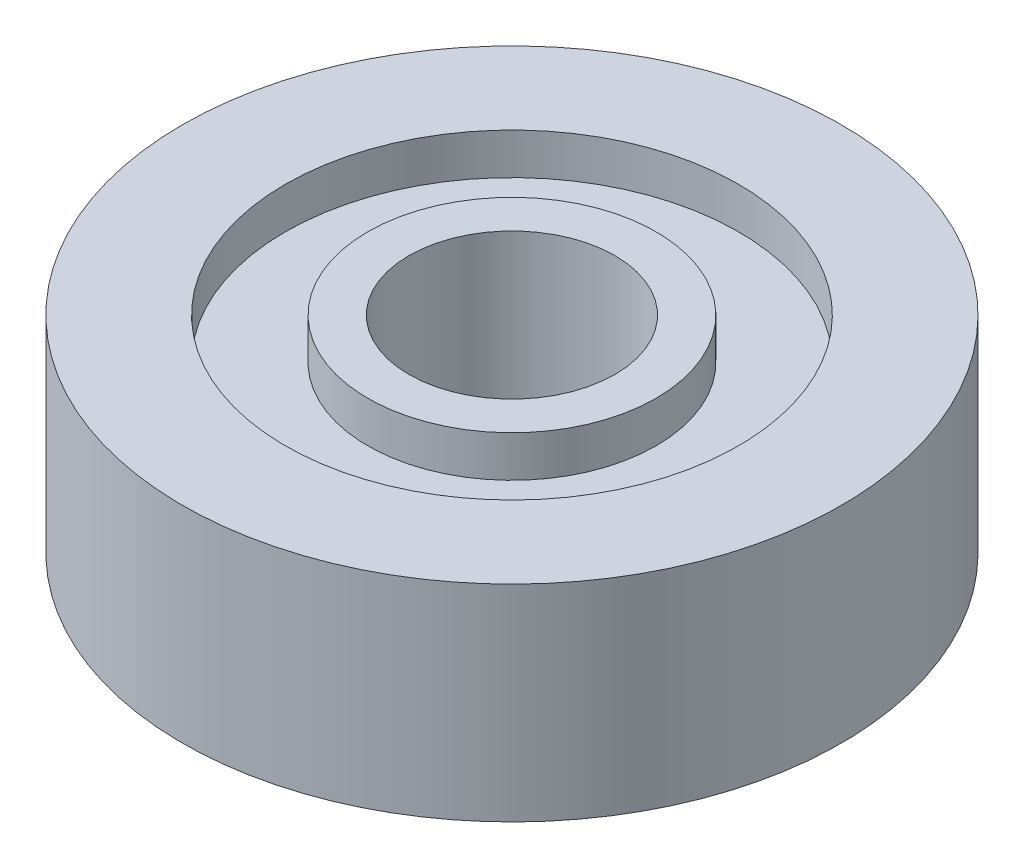
ISO-10303-21;
HEADER;
FILE_DESCRIPTION(('STEP AP214'),'2;1');
FILE_NAME('part.step','',(''),(''),'','','');
FILE_SCHEMA(('AUTOMOTIVE_DESIGN { 1 0 10303 214 1 1 1 1 }'));
ENDSEC;
DATA;
#1=APPLICATION_CONTEXT('core data for automotive mechanical design processes');
#2=APPLICATION_PROTOCOL_DEFINITION('international standard','automotive_design',2000,#1);
#3=PRODUCT_CONTEXT('',#1,'mechanical');
#4=PRODUCT('Part','Part','',(#3));
#5=PRODUCT_RELATED_PRODUCT_CATEGORY('part','',(#4));
#6=PRODUCT_DEFINITION_FORMATION('','',#4);
#7=PRODUCT_DEFINITION_CONTEXT('part definition',#1,'design');
#8=PRODUCT_DEFINITION('design','',#6,#7);
#9=PRODUCT_DEFINITION_SHAPE('','',#8);
#10=(LENGTH_UNIT() NAMED_UNIT(*) SI_UNIT(.MILLI.,.METRE.));
#11=(NAMED_UNIT(*) PLANE_ANGLE_UNIT() SI_UNIT($,.RADIAN.));
#12=(NAMED_UNIT(*) SI_UNIT($,.STERADIAN.) SOLID_ANGLE_UNIT());
#13=UNCERTAINTY_MEASURE_WITH_UNIT(LENGTH_MEASURE(1.E-05),#10,'distance_accuracy_value','');
#14=(GEOMETRIC_REPRESENTATION_CONTEXT(3) GLOBAL_UNCERTAINTY_ASSIGNED_CONTEXT((#13)) GLOBAL_UNIT_ASSIGNED_CONTEXT((#10,
#11,#12)) REPRESENTATION_CONTEXT('',''));
#15=CARTESIAN_POINT('',(0.,0.,0.));
#16=DIRECTION('',(0.,0.,1.));
#17=DIRECTION('',(1.,0.,0.));
#18=AXIS2_PLACEMENT_3D('',#15,#16,#17);
#19=CARTESIAN_POINT('',(1.10274257813603,7.86964267959614,0.));
#20=DIRECTION('',(0.,1.,0.));
#21=DIRECTION('',(-1.,0.,0.));
#22=AXIS2_PLACEMENT_3D('',#19,#20,#21);
#23=CYLINDRICAL_SURFACE('',#22,2.5);
#24=CARTESIAN_POINT('',(1.10274257813603,-2.5,0.));
#25=DIRECTION('',(0.,1.,0.));
#26=DIRECTION('',(-1.,0.,0.));
#27=AXIS2_PLACEMENT_3D('',#24,#25,#26);
#28=CIRCLE('',#27,2.5);
#29=CARTESIAN_POINT('',(-1.39725742186397,-2.5,0.));
#30=VERTEX_POINT('',#29);
#31=EDGE_CURVE('E10',#30,#30,#28,.T.);
#32=ORIENTED_EDGE('',*,*,#31,.F.);
#33=EDGE_LOOP('',(#32));
#34=FACE_BOUND('',#33,.T.);
#35=CARTESIAN_POINT('',(1.10274257813603,2.5,0.));
#36=DIRECTION('',(0.,1.,0.));
#37=DIRECTION('',(-1.,0.,0.));
#38=AXIS2_PLACEMENT_3D('',#35,#36,#37);
#39=CIRCLE('',#38,2.5);
#40=CARTESIAN_POINT('',(-1.39725742186397,2.5,0.));
#41=VERTEX_POINT('',#40);
#42=EDGE_CURVE('E71',#41,#41,#39,.T.);
#43=ORIENTED_EDGE('',*,*,#42,.T.);
#44=EDGE_LOOP('',(#43));
#45=FACE_BOUND('',#44,.T.);
#46=ADVANCED_FACE('F31',(#34,#45),#23,.F.);
#47=CARTESIAN_POINT('',(3.60274257813603,-2.5,0.));
#48=DIRECTION('',(0.,1.,0.));
#49=DIRECTION('',(-1.,0.,0.));
#50=AXIS2_PLACEMENT_3D('',#47,#48,#49);
#51=PLANE('',#50);
#52=CARTESIAN_POINT('',(1.10274257813603,-2.5,0.));
#53=DIRECTION('',(0.,1.,0.));
#54=DIRECTION('',(-1.,0.,0.));
#55=AXIS2_PLACEMENT_3D('',#52,#53,#54);
#56=CIRCLE('',#55,3.5);
#57=CARTESIAN_POINT('',(-2.39725742186397,-2.5,0.));
#58=VERTEX_POINT('',#57);
#59=EDGE_CURVE('E37',#58,#58,#56,.T.);
#60=ORIENTED_EDGE('',*,*,#59,.F.);
#61=EDGE_LOOP('',(#60));
#62=FACE_BOUND('',#61,.T.);
#63=ORIENTED_EDGE('',*,*,#31,.T.);
#64=EDGE_LOOP('',(#63));
#65=FACE_BOUND('',#64,.T.);
#66=ADVANCED_FACE('F132',(#62,#65),#51,.F.);
#67=CARTESIAN_POINT('',(1.10274257813603,7.86964267959614,0.));
#68=DIRECTION('',(0.,1.,0.));
#69=DIRECTION('',(-1.,0.,0.));
#70=AXIS2_PLACEMENT_3D('',#67,#68,#69);
#71=CYLINDRICAL_SURFACE('',#70,3.5);
#72=CARTESIAN_POINT('',(1.10274257813603,-1.5,0.));
#73=DIRECTION('',(0.,1.,0.));
#74=DIRECTION('',(-1.,0.,0.));
#75=AXIS2_PLACEMENT_3D('',#72,#73,#74);
#76=CIRCLE('',#75,3.5);
#77=CARTESIAN_POINT('',(-2.39725742186397,-1.5,0.));
#78=VERTEX_POINT('',#77);
#79=EDGE_CURVE('E41',#78,#78,#76,.T.);
#80=ORIENTED_EDGE('',*,*,#79,.F.);
#81=EDGE_LOOP('',(#80));
#82=FACE_BOUND('',#81,.T.);
#83=ORIENTED_EDGE('',*,*,#59,.T.);
#84=EDGE_LOOP('',(#83));
#85=FACE_BOUND('',#84,.T.);
#86=ADVANCED_FACE('F127',(#82,#85),#71,.T.);
#87=CARTESIAN_POINT('',(4.60274257813603,-1.5,0.));
#88=DIRECTION('',(0.,1.,0.));
#89=DIRECTION('',(-1.,0.,0.));
#90=AXIS2_PLACEMENT_3D('',#87,#88,#89);
#91=PLANE('',#90);
#92=CARTESIAN_POINT('',(1.10274257813603,-1.5,0.));
#93=DIRECTION('',(0.,1.,0.));
#94=DIRECTION('',(-1.,0.,0.));
#95=AXIS2_PLACEMENT_3D('',#92,#93,#94);
#96=CIRCLE('',#95,5.5);
#97=CARTESIAN_POINT('',(-4.39725742186397,-1.5,0.));
#98=VERTEX_POINT('',#97);
#99=EDGE_CURVE('E45',#98,#98,#96,.T.);
#100=ORIENTED_EDGE('',*,*,#99,.F.);
#101=EDGE_LOOP('',(#100));
#102=FACE_BOUND('',#101,.T.);
#103=ORIENTED_EDGE('',*,*,#79,.T.);
#104=EDGE_LOOP('',(#103));
#105=FACE_BOUND('',#104,.T.);
#106=ADVANCED_FACE('F121',(#102,#105),#91,.F.);
#107=CARTESIAN_POINT('',(1.10274257813603,7.86964267959614,0.));
#108=DIRECTION('',(0.,1.,0.));
#109=DIRECTION('',(-1.,0.,0.));
#110=AXIS2_PLACEMENT_3D('',#107,#108,#109);
#111=CYLINDRICAL_SURFACE('',#110,5.5);
#112=CARTESIAN_POINT('',(1.10274257813603,-2.5,0.));
#113=DIRECTION('',(0.,1.,0.));
#114=DIRECTION('',(-1.,0.,0.));
#115=AXIS2_PLACEMENT_3D('',#112,#113,#114);
#116=CIRCLE('',#115,5.5);
#117=CARTESIAN_POINT('',(-4.39725742186397,-2.5,0.));
#118=VERTEX_POINT('',#117);
#119=EDGE_CURVE('E50',#118,#118,#116,.T.);
#120=ORIENTED_EDGE('',*,*,#119,.F.);
#121=EDGE_LOOP('',(#120));
#122=FACE_BOUND('',#121,.T.);
#123=ORIENTED_EDGE('',*,*,#99,.T.);
#124=EDGE_LOOP('',(#123));
#125=FACE_BOUND('',#124,.T.);
#126=ADVANCED_FACE('F115',(#122,#125),#111,.F.);
#127=CARTESIAN_POINT('',(6.60274257813603,-2.5,0.));
#128=DIRECTION('',(0.,1.,0.));
#129=DIRECTION('',(-1.,0.,0.));
#130=AXIS2_PLACEMENT_3D('',#127,#128,#129);
#131=PLANE('',#130);
#132=CARTESIAN_POINT('',(1.10274257813603,-2.5,0.));
#133=DIRECTION('',(0.,1.,0.));
#134=DIRECTION('',(-1.,0.,0.));
#135=AXIS2_PLACEMENT_3D('',#132,#133,#134);
#136=CIRCLE('',#135,8.);
#137=CARTESIAN_POINT('',(-6.89725742186397,-2.5,0.));
#138=VERTEX_POINT('',#137);
#139=EDGE_CURVE('E53',#138,#138,#136,.T.);
#140=ORIENTED_EDGE('',*,*,#139,.F.);
#141=EDGE_LOOP('',(#140));
#142=FACE_BOUND('',#141,.T.);
#143=ORIENTED_EDGE('',*,*,#119,.T.);
#144=EDGE_LOOP('',(#143));
#145=FACE_BOUND('',#144,.T.);
#146=ADVANCED_FACE('F109',(#142,#145),#131,.F.);
#147=CARTESIAN_POINT('',(1.10274257813603,7.86964267959614,0.));
#148=DIRECTION('',(0.,1.,0.));
#149=DIRECTION('',(-1.,0.,0.));
#150=AXIS2_PLACEMENT_3D('',#147,#148,#149);
#151=CYLINDRICAL_SURFACE('',#150,8.);
#152=CARTESIAN_POINT('',(1.10274257813603,2.5,0.));
#153=DIRECTION('',(0.,1.,0.));
#154=DIRECTION('',(-1.,0.,0.));
#155=AXIS2_PLACEMENT_3D('',#152,#153,#154);
#156=CIRCLE('',#155,8.);
#157=CARTESIAN_POINT('',(-6.89725742186397,2.5,0.));
#158=VERTEX_POINT('',#157);
#159=EDGE_CURVE('E56',#158,#158,#156,.T.);
#160=ORIENTED_EDGE('',*,*,#159,.F.);
#161=EDGE_LOOP('',(#160));
#162=FACE_BOUND('',#161,.T.);
#163=ORIENTED_EDGE('',*,*,#139,.T.);
#164=EDGE_LOOP('',(#163));
#165=FACE_BOUND('',#164,.T.);
#166=ADVANCED_FACE('F103',(#162,#165),#151,.T.);
#167=CARTESIAN_POINT('',(9.10274257813603,2.5,0.));
#168=DIRECTION('',(0.,-1.,0.));
#169=DIRECTION('',(1.,0.,0.));
#170=AXIS2_PLACEMENT_3D('',#167,#168,#169);
#171=PLANE('',#170);
#172=CARTESIAN_POINT('',(1.10274257813603,2.5,0.));
#173=DIRECTION('',(0.,1.,0.));
#174=DIRECTION('',(-1.,0.,0.));
#175=AXIS2_PLACEMENT_3D('',#172,#173,#174);
#176=CIRCLE('',#175,5.5);
#177=CARTESIAN_POINT('',(-4.39725742186397,2.5,0.));
#178=VERTEX_POINT('',#177);
#179=EDGE_CURVE('E59',#178,#178,#176,.T.);
#180=ORIENTED_EDGE('',*,*,#179,.F.);
#181=EDGE_LOOP('',(#180));
#182=FACE_BOUND('',#181,.T.);
#183=ORIENTED_EDGE('',*,*,#159,.T.);
#184=EDGE_LOOP('',(#183));
#185=FACE_BOUND('',#184,.T.);
#186=ADVANCED_FACE('F97',(#182,#185),#171,.F.);
#187=CARTESIAN_POINT('',(1.10274257813603,7.86964267959614,0.));
#188=DIRECTION('',(0.,1.,0.));
#189=DIRECTION('',(-1.,0.,0.));
#190=AXIS2_PLACEMENT_3D('',#187,#188,#189);
#191=CYLINDRICAL_SURFACE('',#190,5.5);
#192=CARTESIAN_POINT('',(1.10274257813603,1.5,0.));
#193=DIRECTION('',(0.,1.,0.));
#194=DIRECTION('',(-1.,0.,0.));
#195=AXIS2_PLACEMENT_3D('',#192,#193,#194);
#196=CIRCLE('',#195,5.5);
#197=CARTESIAN_POINT('',(-4.39725742186397,1.5,0.));
#198=VERTEX_POINT('',#197);
#199=EDGE_CURVE('E62',#198,#198,#196,.T.);
#200=ORIENTED_EDGE('',*,*,#199,.F.);
#201=EDGE_LOOP('',(#200));
#202=FACE_BOUND('',#201,.T.);
#203=ORIENTED_EDGE('',*,*,#179,.T.);
#204=EDGE_LOOP('',(#203));
#205=FACE_BOUND('',#204,.T.);
#206=ADVANCED_FACE('F91',(#202,#205),#191,.F.);
#207=CARTESIAN_POINT('',(4.60274257813603,1.5,0.));
#208=DIRECTION('',(0.,-1.,0.));
#209=DIRECTION('',(1.,0.,0.));
#210=AXIS2_PLACEMENT_3D('',#207,#208,#209);
#211=PLANE('',#210);
#212=CARTESIAN_POINT('',(1.10274257813603,1.5,0.));
#213=DIRECTION('',(0.,1.,0.));
#214=DIRECTION('',(-1.,0.,0.));
#215=AXIS2_PLACEMENT_3D('',#212,#213,#214);
#216=CIRCLE('',#215,3.5);
#217=CARTESIAN_POINT('',(-2.39725742186397,1.5,0.));
#218=VERTEX_POINT('',#217);
#219=EDGE_CURVE('E65',#218,#218,#216,.T.);
#220=ORIENTED_EDGE('',*,*,#219,.F.);
#221=EDGE_LOOP('',(#220));
#222=FACE_BOUND('',#221,.T.);
#223=ORIENTED_EDGE('',*,*,#199,.T.);
#224=EDGE_LOOP('',(#223));
#225=FACE_BOUND('',#224,.T.);
#226=ADVANCED_FACE('F85',(#222,#225),#211,.F.);
#227=CARTESIAN_POINT('',(1.10274257813603,7.86964267959614,0.));
#228=DIRECTION('',(0.,1.,0.));
#229=DIRECTION('',(-1.,0.,0.));
#230=AXIS2_PLACEMENT_3D('',#227,#228,#229);
#231=CYLINDRICAL_SURFACE('',#230,3.5);
#232=CARTESIAN_POINT('',(1.10274257813603,2.5,0.));
#233=DIRECTION('',(0.,1.,0.));
#234=DIRECTION('',(-1.,0.,0.));
#235=AXIS2_PLACEMENT_3D('',#232,#233,#234);
#236=CIRCLE('',#235,3.5);
#237=CARTESIAN_POINT('',(-2.39725742186397,2.5,0.));
#238=VERTEX_POINT('',#237);
#239=EDGE_CURVE('E68',#238,#238,#236,.T.);
#240=ORIENTED_EDGE('',*,*,#239,.F.);
#241=EDGE_LOOP('',(#240));
#242=FACE_BOUND('',#241,.T.);
#243=ORIENTED_EDGE('',*,*,#219,.T.);
#244=EDGE_LOOP('',(#243));
#245=FACE_BOUND('',#244,.T.);
#246=ADVANCED_FACE('F79',(#242,#245),#231,.T.);
#247=CARTESIAN_POINT('',(4.60274257813603,2.5,0.));
#248=DIRECTION('',(0.,-1.,0.));
#249=DIRECTION('',(1.,0.,0.));
#250=AXIS2_PLACEMENT_3D('',#247,#248,#249);
#251=PLANE('',#250);
#252=ORIENTED_EDGE('',*,*,#42,.F.);
#253=EDGE_LOOP('',(#252));
#254=FACE_BOUND('',#253,.T.);
#255=ORIENTED_EDGE('',*,*,#239,.T.);
#256=EDGE_LOOP('',(#255));
#257=FACE_BOUND('',#256,.T.);
#258=ADVANCED_FACE('F76',(#254,#257),#251,.F.);
#259=CLOSED_SHELL('',(#46,#66,#86,#106,#126,#146,#166,#186,#206,#226,#246,#258));
#260=MANIFOLD_SOLID_BREP('B2',#259);
#261=ADVANCED_BREP_SHAPE_REPRESENTATION('',(#18,#260),#14);
#262=SHAPE_DEFINITION_REPRESENTATION(#9,#261);
ENDSEC;
END-ISO-10303-21;
